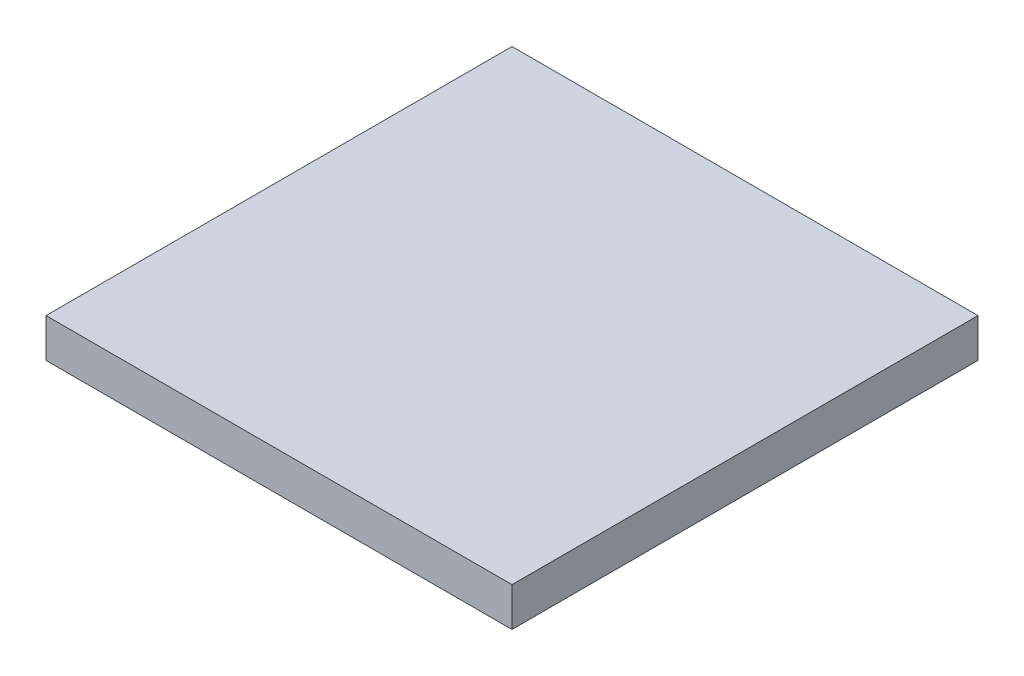
ISO-10303-21;
HEADER;
FILE_DESCRIPTION(('STEP AP214'),'2;1');
FILE_NAME('part.step','',(''),(''),'','','');
FILE_SCHEMA(('AUTOMOTIVE_DESIGN { 1 0 10303 214 1 1 1 1 }'));
ENDSEC;
DATA;
#1=APPLICATION_CONTEXT('core data for automotive mechanical design processes');
#2=APPLICATION_PROTOCOL_DEFINITION('international standard','automotive_design',2000,#1);
#3=PRODUCT_CONTEXT('',#1,'mechanical');
#4=PRODUCT('Part','Part','',(#3));
#5=PRODUCT_RELATED_PRODUCT_CATEGORY('part','',(#4));
#6=PRODUCT_DEFINITION_FORMATION('','',#4);
#7=PRODUCT_DEFINITION_CONTEXT('part definition',#1,'design');
#8=PRODUCT_DEFINITION('design','',#6,#7);
#9=PRODUCT_DEFINITION_SHAPE('','',#8);
#10=(LENGTH_UNIT() NAMED_UNIT(*) SI_UNIT(.MILLI.,.METRE.));
#11=(NAMED_UNIT(*) PLANE_ANGLE_UNIT() SI_UNIT($,.RADIAN.));
#12=(NAMED_UNIT(*) SI_UNIT($,.STERADIAN.) SOLID_ANGLE_UNIT());
#13=UNCERTAINTY_MEASURE_WITH_UNIT(LENGTH_MEASURE(1.E-05),#10,'distance_accuracy_value','');
#14=(GEOMETRIC_REPRESENTATION_CONTEXT(3) GLOBAL_UNCERTAINTY_ASSIGNED_CONTEXT((#13)) GLOBAL_UNIT_ASSIGNED_CONTEXT((#10,
#11,#12)) REPRESENTATION_CONTEXT('',''));
#15=CARTESIAN_POINT('',(0.,0.,0.));
#16=DIRECTION('',(0.,0.,1.));
#17=DIRECTION('',(1.,0.,0.));
#18=AXIS2_PLACEMENT_3D('',#15,#16,#17);
#19=CARTESIAN_POINT('',(30.,5.,30.));
#20=DIRECTION('',(-1.,0.,0.));
#21=DIRECTION('',(0.,0.,1.));
#22=AXIS2_PLACEMENT_3D('',#19,#20,#21);
#23=PLANE('',#22);
#24=DIRECTION('',(0.,0.,-1.));
#25=VECTOR('',#24,1.);
#26=CARTESIAN_POINT('',(30.,0.,30.));
#27=LINE('',#26,#25);
#28=CARTESIAN_POINT('',(30.,0.,30.));
#29=VERTEX_POINT('',#28);
#30=CARTESIAN_POINT('',(30.,0.,-30.));
#31=VERTEX_POINT('',#30);
#32=EDGE_CURVE('E95',#29,#31,#27,.T.);
#33=ORIENTED_EDGE('',*,*,#32,.T.);
#34=DIRECTION('',(0.,-1.,0.));
#35=VECTOR('',#34,1.);
#36=CARTESIAN_POINT('',(30.,5.,-30.));
#37=LINE('',#36,#35);
#38=CARTESIAN_POINT('',(30.,5.,-30.));
#39=VERTEX_POINT('',#38);
#40=EDGE_CURVE('E11',#39,#31,#37,.T.);
#41=ORIENTED_EDGE('',*,*,#40,.F.);
#42=DIRECTION('',(0.,0.,-1.));
#43=VECTOR('',#42,1.);
#44=CARTESIAN_POINT('',(30.,5.,30.));
#45=LINE('',#44,#43);
#46=CARTESIAN_POINT('',(30.,5.,30.));
#47=VERTEX_POINT('',#46);
#48=EDGE_CURVE('E83',#47,#39,#45,.T.);
#49=ORIENTED_EDGE('',*,*,#48,.F.);
#50=DIRECTION('',(0.,-1.,0.));
#51=VECTOR('',#50,1.);
#52=CARTESIAN_POINT('',(30.,5.,30.));
#53=LINE('',#52,#51);
#54=EDGE_CURVE('E91',#47,#29,#53,.T.);
#55=ORIENTED_EDGE('',*,*,#54,.T.);
#56=EDGE_LOOP('',(#33,#41,#49,#55));
#57=FACE_BOUND('',#56,.T.);
#58=ADVANCED_FACE('F32',(#57),#23,.F.);
#59=CARTESIAN_POINT('',(-30.,5.,-30.));
#60=DIRECTION('',(0.,0.,1.));
#61=DIRECTION('',(1.,0.,0.));
#62=AXIS2_PLACEMENT_3D('',#59,#60,#61);
#63=PLANE('',#62);
#64=DIRECTION('',(-1.,0.,0.));
#65=VECTOR('',#64,1.);
#66=CARTESIAN_POINT('',(-30.,0.,-30.));
#67=LINE('',#66,#65);
#68=CARTESIAN_POINT('',(-30.,0.,-30.));
#69=VERTEX_POINT('',#68);
#70=EDGE_CURVE('E87',#31,#69,#67,.T.);
#71=ORIENTED_EDGE('',*,*,#70,.T.);
#72=DIRECTION('',(0.,-1.,0.));
#73=VECTOR('',#72,1.);
#74=CARTESIAN_POINT('',(-30.,5.,-30.));
#75=LINE('',#74,#73);
#76=CARTESIAN_POINT('',(-30.,5.,-30.));
#77=VERTEX_POINT('',#76);
#78=EDGE_CURVE('E40',#77,#69,#75,.T.);
#79=ORIENTED_EDGE('',*,*,#78,.F.);
#80=DIRECTION('',(-1.,0.,0.));
#81=VECTOR('',#80,1.);
#82=CARTESIAN_POINT('',(-30.,5.,-30.));
#83=LINE('',#82,#81);
#84=EDGE_CURVE('E78',#39,#77,#83,.T.);
#85=ORIENTED_EDGE('',*,*,#84,.F.);
#86=ORIENTED_EDGE('',*,*,#40,.T.);
#87=EDGE_LOOP('',(#71,#79,#85,#86));
#88=FACE_BOUND('',#87,.T.);
#89=ADVANCED_FACE('F86',(#88),#63,.F.);
#90=CARTESIAN_POINT('',(-30.,5.,30.));
#91=DIRECTION('',(1.,0.,0.));
#92=DIRECTION('',(0.,0.,-1.));
#93=AXIS2_PLACEMENT_3D('',#90,#91,#92);
#94=PLANE('',#93);
#95=DIRECTION('',(0.,0.,1.));
#96=VECTOR('',#95,1.);
#97=CARTESIAN_POINT('',(-30.,0.,30.));
#98=LINE('',#97,#96);
#99=CARTESIAN_POINT('',(-30.,0.,30.));
#100=VERTEX_POINT('',#99);
#101=EDGE_CURVE('E65',#69,#100,#98,.T.);
#102=ORIENTED_EDGE('',*,*,#101,.T.);
#103=DIRECTION('',(0.,-1.,0.));
#104=VECTOR('',#103,1.);
#105=CARTESIAN_POINT('',(-30.,5.,30.));
#106=LINE('',#105,#104);
#107=CARTESIAN_POINT('',(-30.,5.,30.));
#108=VERTEX_POINT('',#107);
#109=EDGE_CURVE('E88',#108,#100,#106,.T.);
#110=ORIENTED_EDGE('',*,*,#109,.F.);
#111=DIRECTION('',(0.,0.,1.));
#112=VECTOR('',#111,1.);
#113=CARTESIAN_POINT('',(-30.,5.,30.));
#114=LINE('',#113,#112);
#115=EDGE_CURVE('E81',#77,#108,#114,.T.);
#116=ORIENTED_EDGE('',*,*,#115,.F.);
#117=ORIENTED_EDGE('',*,*,#78,.T.);
#118=EDGE_LOOP('',(#102,#110,#116,#117));
#119=FACE_BOUND('',#118,.T.);
#120=ADVANCED_FACE('F89',(#119),#94,.F.);
#121=CARTESIAN_POINT('',(-30.,5.,30.));
#122=DIRECTION('',(0.,0.,-1.));
#123=DIRECTION('',(-1.,0.,0.));
#124=AXIS2_PLACEMENT_3D('',#121,#122,#123);
#125=PLANE('',#124);
#126=DIRECTION('',(1.,0.,0.));
#127=VECTOR('',#126,1.);
#128=CARTESIAN_POINT('',(-30.,0.,30.));
#129=LINE('',#128,#127);
#130=EDGE_CURVE('E71',#100,#29,#129,.T.);
#131=ORIENTED_EDGE('',*,*,#130,.T.);
#132=ORIENTED_EDGE('',*,*,#54,.F.);
#133=DIRECTION('',(1.,0.,0.));
#134=VECTOR('',#133,1.);
#135=CARTESIAN_POINT('',(-30.,5.,30.));
#136=LINE('',#135,#134);
#137=EDGE_CURVE('E48',#108,#47,#136,.T.);
#138=ORIENTED_EDGE('',*,*,#137,.F.);
#139=ORIENTED_EDGE('',*,*,#109,.T.);
#140=EDGE_LOOP('',(#131,#132,#138,#139));
#141=FACE_BOUND('',#140,.T.);
#142=ADVANCED_FACE('F102',(#141),#125,.F.);
#143=CARTESIAN_POINT('',(0.,5.,0.));
#144=DIRECTION('',(0.,-1.,0.));
#145=DIRECTION('',(0.,0.,-1.));
#146=AXIS2_PLACEMENT_3D('',#143,#144,#145);
#147=PLANE('',#146);
#148=ORIENTED_EDGE('',*,*,#48,.T.);
#149=ORIENTED_EDGE('',*,*,#84,.T.);
#150=ORIENTED_EDGE('',*,*,#115,.T.);
#151=ORIENTED_EDGE('',*,*,#137,.T.);
#152=EDGE_LOOP('',(#148,#149,#150,#151));
#153=FACE_BOUND('',#152,.T.);
#154=ADVANCED_FACE('F79',(#153),#147,.F.);
#155=CARTESIAN_POINT('',(0.,0.,0.));
#156=DIRECTION('',(0.,-1.,0.));
#157=DIRECTION('',(0.,0.,-1.));
#158=AXIS2_PLACEMENT_3D('',#155,#156,#157);
#159=PLANE('',#158);
#160=ORIENTED_EDGE('',*,*,#32,.F.);
#161=ORIENTED_EDGE('',*,*,#130,.F.);
#162=ORIENTED_EDGE('',*,*,#101,.F.);
#163=ORIENTED_EDGE('',*,*,#70,.F.);
#164=EDGE_LOOP('',(#160,#161,#162,#163));
#165=FACE_BOUND('',#164,.T.);
#166=ADVANCED_FACE('F105',(#165),#159,.T.);
#167=CLOSED_SHELL('',(#58,#89,#120,#142,#154,#166));
#168=MANIFOLD_SOLID_BREP('B2',#167);
#169=ADVANCED_BREP_SHAPE_REPRESENTATION('',(#18,#168),#14);
#170=SHAPE_DEFINITION_REPRESENTATION(#9,#169);
ENDSEC;
END-ISO-10303-21;
